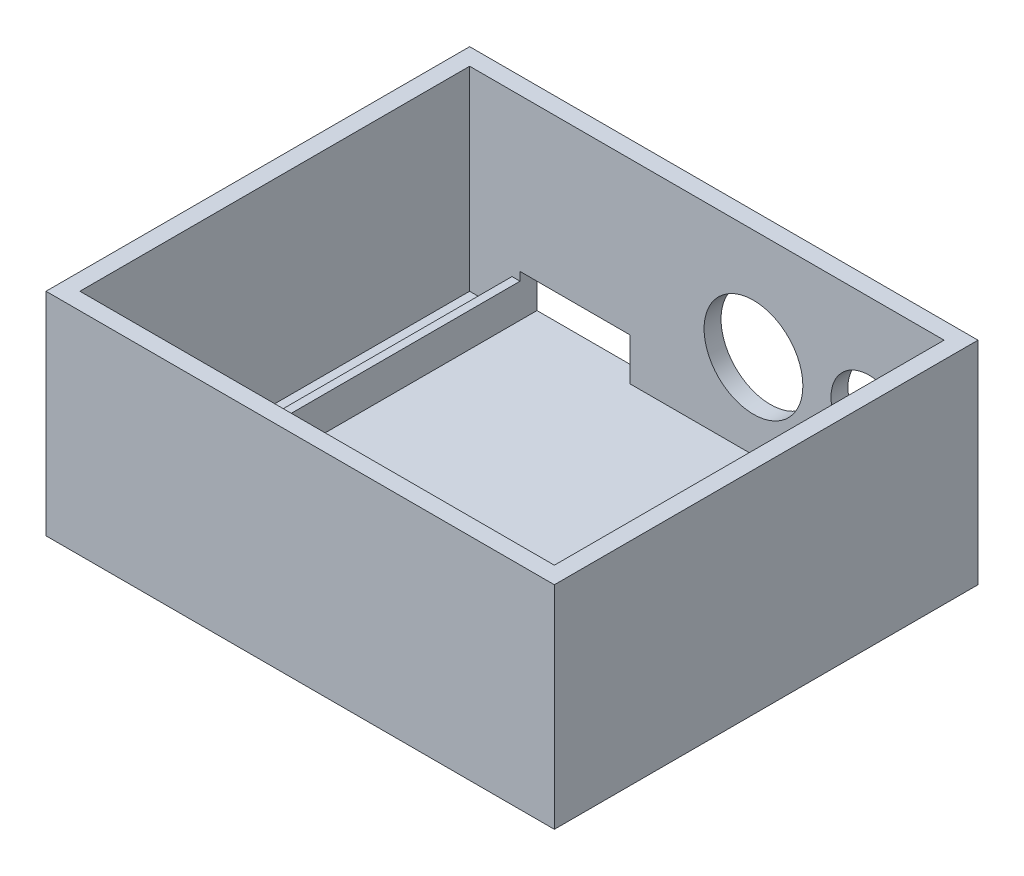
ISO-10303-21;
HEADER;
FILE_DESCRIPTION(('STEP AP214'),'2;1');
FILE_NAME('part.step','',(''),(''),'','','');
FILE_SCHEMA(('AUTOMOTIVE_DESIGN { 1 0 10303 214 1 1 1 1 }'));
ENDSEC;
DATA;
#1=APPLICATION_CONTEXT('core data for automotive mechanical design processes');
#2=APPLICATION_PROTOCOL_DEFINITION('international standard','automotive_design',2000,#1);
#3=PRODUCT_CONTEXT('',#1,'mechanical');
#4=PRODUCT('Part','Part','',(#3));
#5=PRODUCT_RELATED_PRODUCT_CATEGORY('part','',(#4));
#6=PRODUCT_DEFINITION_FORMATION('','',#4);
#7=PRODUCT_DEFINITION_CONTEXT('part definition',#1,'design');
#8=PRODUCT_DEFINITION('design','',#6,#7);
#9=PRODUCT_DEFINITION_SHAPE('','',#8);
#10=(LENGTH_UNIT() NAMED_UNIT(*) SI_UNIT(.MILLI.,.METRE.));
#11=(NAMED_UNIT(*) PLANE_ANGLE_UNIT() SI_UNIT($,.RADIAN.));
#12=(NAMED_UNIT(*) SI_UNIT($,.STERADIAN.) SOLID_ANGLE_UNIT());
#13=UNCERTAINTY_MEASURE_WITH_UNIT(LENGTH_MEASURE(1.E-05),#10,'distance_accuracy_value','');
#14=(GEOMETRIC_REPRESENTATION_CONTEXT(3) GLOBAL_UNCERTAINTY_ASSIGNED_CONTEXT((#13)) GLOBAL_UNIT_ASSIGNED_CONTEXT((#10,
#11,#12)) REPRESENTATION_CONTEXT('',''));
#15=CARTESIAN_POINT('',(0.,0.,0.));
#16=DIRECTION('',(0.,0.,1.));
#17=DIRECTION('',(1.,0.,0.));
#18=AXIS2_PLACEMENT_3D('',#15,#16,#17);
#19=CARTESIAN_POINT('',(-66.5712229422652,4.,-56.0826927806848));
#20=DIRECTION('',(0.,0.,-1.));
#21=DIRECTION('',(-1.,0.,0.));
#22=AXIS2_PLACEMENT_3D('',#19,#20,#21);
#23=PLANE('',#22);
#24=CARTESIAN_POINT('',(0.42877705773485,24.,-56.0826927806848));
#25=DIRECTION('',(0.,0.,1.));
#26=DIRECTION('',(1.,0.,0.));
#27=AXIS2_PLACEMENT_3D('',#24,#25,#26);
#28=CIRCLE('',#27,11.6621974263481);
#29=CARTESIAN_POINT('',(12.090974484083,24.,-56.0826927806848));
#30=VERTEX_POINT('',#29);
#31=EDGE_CURVE('E336',#30,#30,#28,.T.);
#32=ORIENTED_EDGE('',*,*,#31,.F.);
#33=EDGE_LOOP('',(#32));
#34=FACE_BOUND('',#33,.T.);
#35=CARTESIAN_POINT('',(27.7287770577348,25.,-56.0826927806848));
#36=DIRECTION('',(0.,0.,-1.));
#37=DIRECTION('',(-1.,0.,0.));
#38=AXIS2_PLACEMENT_3D('',#35,#36,#37);
#39=CIRCLE('',#38,9.);
#40=CARTESIAN_POINT('',(18.7287770577348,25.,-56.0826927806848));
#41=VERTEX_POINT('',#40);
#42=EDGE_CURVE('E328',#41,#41,#39,.T.);
#43=ORIENTED_EDGE('',*,*,#42,.T.);
#44=EDGE_LOOP('',(#43));
#45=FACE_BOUND('',#44,.T.);
#46=DIRECTION('',(1.,0.,0.));
#47=VECTOR('',#46,1.);
#48=CARTESIAN_POINT('',(-66.5712229422652,12.,-56.0826927806848));
#49=LINE('',#48,#47);
#50=CARTESIAN_POINT('',(-56.5712229422651,12.,-56.0826927806848));
#51=VERTEX_POINT('',#50);
#52=CARTESIAN_POINT('',(-54.6743041305773,12.,-56.0826927806848));
#53=VERTEX_POINT('',#52);
#54=EDGE_CURVE('E226',#51,#53,#49,.T.);
#55=ORIENTED_EDGE('',*,*,#54,.T.);
#56=DIRECTION('',(0.,-1.,0.));
#57=VECTOR('',#56,1.);
#58=CARTESIAN_POINT('',(-54.6743041305773,4.,-56.0826927806848));
#59=LINE('',#58,#57);
#60=CARTESIAN_POINT('',(-54.6743041305773,14.,-56.0826927806848));
#61=VERTEX_POINT('',#60);
#62=EDGE_CURVE('E159',#61,#53,#59,.T.);
#63=ORIENTED_EDGE('',*,*,#62,.F.);
#64=DIRECTION('',(-1.,0.,0.));
#65=VECTOR('',#64,1.);
#66=CARTESIAN_POINT('',(-54.6743041305773,14.,-56.0826927806848));
#67=LINE('',#66,#65);
#68=CARTESIAN_POINT('',(-28.6743041305773,14.,-56.0826927806848));
#69=VERTEX_POINT('',#68);
#70=EDGE_CURVE('E151',#69,#61,#67,.T.);
#71=ORIENTED_EDGE('',*,*,#70,.F.);
#72=DIRECTION('',(0.,1.,0.));
#73=VECTOR('',#72,1.);
#74=CARTESIAN_POINT('',(-28.6743041305773,4.,-56.0826927806848));
#75=LINE('',#74,#73);
#76=CARTESIAN_POINT('',(-28.6743041305773,4.,-56.0826927806848));
#77=VERTEX_POINT('',#76);
#78=EDGE_CURVE('E145',#77,#69,#75,.T.);
#79=ORIENTED_EDGE('',*,*,#78,.F.);
#80=DIRECTION('',(-1.,0.,0.));
#81=VECTOR('',#80,1.);
#82=CARTESIAN_POINT('',(-66.5712229422652,4.,-56.0826927806848));
#83=LINE('',#82,#81);
#84=CARTESIAN_POINT('',(45.4287770577348,4.,-56.0826927806848));
#85=VERTEX_POINT('',#84);
#86=EDGE_CURVE('E156',#85,#77,#83,.T.);
#87=ORIENTED_EDGE('',*,*,#86,.F.);
#88=DIRECTION('',(0.,1.,0.));
#89=VECTOR('',#88,1.);
#90=CARTESIAN_POINT('',(45.4287770577348,4.,-56.0826927806848));
#91=LINE('',#90,#89);
#92=CARTESIAN_POINT('',(45.4287770577348,50.,-56.0826927806848));
#93=VERTEX_POINT('',#92);
#94=EDGE_CURVE('E191',#85,#93,#91,.T.);
#95=ORIENTED_EDGE('',*,*,#94,.T.);
#96=DIRECTION('',(-1.,0.,0.));
#97=VECTOR('',#96,1.);
#98=CARTESIAN_POINT('',(-66.5712229422652,50.,-56.0826927806848));
#99=LINE('',#98,#97);
#100=CARTESIAN_POINT('',(-66.5712229422652,50.,-56.0826927806848));
#101=VERTEX_POINT('',#100);
#102=EDGE_CURVE('E184',#93,#101,#99,.T.);
#103=ORIENTED_EDGE('',*,*,#102,.T.);
#104=DIRECTION('',(0.,1.,0.));
#105=VECTOR('',#104,1.);
#106=CARTESIAN_POINT('',(-66.5712229422652,4.,-56.0826927806848));
#107=LINE('',#106,#105);
#108=CARTESIAN_POINT('',(-66.5712229422652,4.,-56.0826927806848));
#109=VERTEX_POINT('',#108);
#110=EDGE_CURVE('E188',#109,#101,#107,.T.);
#111=ORIENTED_EDGE('',*,*,#110,.F.);
#112=CARTESIAN_POINT('',(-56.5712229422651,4.,-56.0826927806848));
#113=VERTEX_POINT('',#112);
#114=EDGE_CURVE('E167',#113,#109,#83,.T.);
#115=ORIENTED_EDGE('',*,*,#114,.F.);
#116=DIRECTION('',(0.,-1.,0.));
#117=VECTOR('',#116,1.);
#118=CARTESIAN_POINT('',(-56.5712229422651,4.,-56.0826927806848));
#119=LINE('',#118,#117);
#120=EDGE_CURVE('E178',#51,#113,#119,.T.);
#121=ORIENTED_EDGE('',*,*,#120,.F.);
#122=EDGE_LOOP('',(#55,#63,#71,#79,#87,#95,#103,#111,#115,#121));
#123=FACE_BOUND('',#122,.T.);
#124=ADVANCED_FACE('F34',(#34,#45,#123),#23,.F.);
#125=CARTESIAN_POINT('',(0.,4.,0.));
#126=DIRECTION('',(0.,1.,0.));
#127=DIRECTION('',(0.,0.,1.));
#128=AXIS2_PLACEMENT_3D('',#125,#126,#127);
#129=PLANE('',#128);
#130=ORIENTED_EDGE('',*,*,#86,.T.);
#131=DIRECTION('',(0.,0.,1.));
#132=VECTOR('',#131,1.);
#133=CARTESIAN_POINT('',(-28.6743041305773,4.,-122.082692780685));
#134=LINE('',#133,#132);
#135=CARTESIAN_POINT('',(-28.6743041305773,4.,-60.0826927806848));
#136=VERTEX_POINT('',#135);
#137=EDGE_CURVE('E50',#136,#77,#134,.T.);
#138=ORIENTED_EDGE('',*,*,#137,.F.);
#139=DIRECTION('',(1.,0.,0.));
#140=VECTOR('',#139,1.);
#141=CARTESIAN_POINT('',(-70.5712229422652,4.,-60.0826927806848));
#142=LINE('',#141,#140);
#143=CARTESIAN_POINT('',(-54.6743041305773,4.,-60.0826927806848));
#144=VERTEX_POINT('',#143);
#145=EDGE_CURVE('E228',#144,#136,#142,.T.);
#146=ORIENTED_EDGE('',*,*,#145,.F.);
#147=DIRECTION('',(0.,0.,1.));
#148=VECTOR('',#147,1.);
#149=CARTESIAN_POINT('',(-54.6743041305773,4.,-56.0826927806848));
#150=LINE('',#149,#148);
#151=CARTESIAN_POINT('',(-54.6743041305773,4.,9.91730721931521));
#152=VERTEX_POINT('',#151);
#153=EDGE_CURVE('E244',#144,#152,#150,.T.);
#154=ORIENTED_EDGE('',*,*,#153,.T.);
#155=DIRECTION('',(1.,0.,0.));
#156=VECTOR('',#155,1.);
#157=CARTESIAN_POINT('',(-56.5712229422652,4.,9.91730721931521));
#158=LINE('',#157,#156);
#159=CARTESIAN_POINT('',(-56.5712229422652,4.,9.91730721931521));
#160=VERTEX_POINT('',#159);
#161=EDGE_CURVE('E247',#160,#152,#158,.T.);
#162=ORIENTED_EDGE('',*,*,#161,.F.);
#163=DIRECTION('',(0.,0.,-1.));
#164=VECTOR('',#163,1.);
#165=CARTESIAN_POINT('',(-56.5712229422652,4.,0.));
#166=LINE('',#165,#164);
#167=EDGE_CURVE('E223',#160,#113,#166,.T.);
#168=ORIENTED_EDGE('',*,*,#167,.T.);
#169=ORIENTED_EDGE('',*,*,#114,.T.);
#170=DIRECTION('',(0.,0.,1.));
#171=VECTOR('',#170,1.);
#172=CARTESIAN_POINT('',(-66.5712229422652,4.,-56.0826927806848));
#173=LINE('',#172,#171);
#174=CARTESIAN_POINT('',(-66.5712229422651,4.,35.9173072193152));
#175=VERTEX_POINT('',#174);
#176=EDGE_CURVE('E187',#109,#175,#173,.T.);
#177=ORIENTED_EDGE('',*,*,#176,.T.);
#178=DIRECTION('',(1.,0.,0.));
#179=VECTOR('',#178,1.);
#180=CARTESIAN_POINT('',(-66.5712229422651,4.,35.9173072193152));
#181=LINE('',#180,#179);
#182=CARTESIAN_POINT('',(45.4287770577348,4.,35.9173072193152));
#183=VERTEX_POINT('',#182);
#184=EDGE_CURVE('E261',#175,#183,#181,.T.);
#185=ORIENTED_EDGE('',*,*,#184,.T.);
#186=DIRECTION('',(0.,0.,-1.));
#187=VECTOR('',#186,1.);
#188=CARTESIAN_POINT('',(45.4287770577348,4.,-56.0826927806848));
#189=LINE('',#188,#187);
#190=EDGE_CURVE('E165',#183,#85,#189,.T.);
#191=ORIENTED_EDGE('',*,*,#190,.T.);
#192=EDGE_LOOP('',(#130,#138,#146,#154,#162,#168,#169,#177,#185,#191));
#193=FACE_BOUND('',#192,.T.);
#194=ADVANCED_FACE('F162',(#193),#129,.T.);
#195=CARTESIAN_POINT('',(-70.5712229422652,50.,39.9173072193152));
#196=DIRECTION('',(1.,0.,0.));
#197=DIRECTION('',(0.,0.,-1.));
#198=AXIS2_PLACEMENT_3D('',#195,#196,#197);
#199=PLANE('',#198);
#200=DIRECTION('',(0.,0.,1.));
#201=VECTOR('',#200,1.);
#202=CARTESIAN_POINT('',(-70.5712229422652,0.,39.9173072193152));
#203=LINE('',#202,#201);
#204=CARTESIAN_POINT('',(-70.5712229422652,0.,-60.0826927806848));
#205=VERTEX_POINT('',#204);
#206=CARTESIAN_POINT('',(-70.5712229422652,0.,39.9173072193152));
#207=VERTEX_POINT('',#206);
#208=EDGE_CURVE('E190',#205,#207,#203,.T.);
#209=ORIENTED_EDGE('',*,*,#208,.T.);
#210=DIRECTION('',(0.,-1.,0.));
#211=VECTOR('',#210,1.);
#212=CARTESIAN_POINT('',(-70.5712229422652,50.,39.9173072193152));
#213=LINE('',#212,#211);
#214=CARTESIAN_POINT('',(-70.5712229422652,50.,39.9173072193152));
#215=VERTEX_POINT('',#214);
#216=EDGE_CURVE('E220',#215,#207,#213,.T.);
#217=ORIENTED_EDGE('',*,*,#216,.F.);
#218=DIRECTION('',(0.,0.,1.));
#219=VECTOR('',#218,1.);
#220=CARTESIAN_POINT('',(-70.5712229422652,50.,39.9173072193152));
#221=LINE('',#220,#219);
#222=CARTESIAN_POINT('',(-70.5712229422652,50.,-60.0826927806848));
#223=VERTEX_POINT('',#222);
#224=EDGE_CURVE('E194',#223,#215,#221,.T.);
#225=ORIENTED_EDGE('',*,*,#224,.F.);
#226=DIRECTION('',(0.,-1.,0.));
#227=VECTOR('',#226,1.);
#228=CARTESIAN_POINT('',(-70.5712229422652,50.,-60.0826927806848));
#229=LINE('',#228,#227);
#230=EDGE_CURVE('E204',#223,#205,#229,.T.);
#231=ORIENTED_EDGE('',*,*,#230,.T.);
#232=EDGE_LOOP('',(#209,#217,#225,#231));
#233=FACE_BOUND('',#232,.T.);
#234=ADVANCED_FACE('F36',(#233),#199,.F.);
#235=CARTESIAN_POINT('',(-70.5712229422652,50.,39.9173072193152));
#236=DIRECTION('',(0.,0.,-1.));
#237=DIRECTION('',(-1.,0.,0.));
#238=AXIS2_PLACEMENT_3D('',#235,#236,#237);
#239=PLANE('',#238);
#240=DIRECTION('',(1.,0.,0.));
#241=VECTOR('',#240,1.);
#242=CARTESIAN_POINT('',(-70.5712229422652,0.,39.9173072193152));
#243=LINE('',#242,#241);
#244=CARTESIAN_POINT('',(49.4287770577348,0.,39.9173072193152));
#245=VERTEX_POINT('',#244);
#246=EDGE_CURVE('E207',#207,#245,#243,.T.);
#247=ORIENTED_EDGE('',*,*,#246,.T.);
#248=DIRECTION('',(0.,-1.,0.));
#249=VECTOR('',#248,1.);
#250=CARTESIAN_POINT('',(49.4287770577348,50.,39.9173072193152));
#251=LINE('',#250,#249);
#252=CARTESIAN_POINT('',(49.4287770577348,50.,39.9173072193152));
#253=VERTEX_POINT('',#252);
#254=EDGE_CURVE('E217',#253,#245,#251,.T.);
#255=ORIENTED_EDGE('',*,*,#254,.F.);
#256=DIRECTION('',(1.,0.,0.));
#257=VECTOR('',#256,1.);
#258=CARTESIAN_POINT('',(-70.5712229422652,50.,39.9173072193152));
#259=LINE('',#258,#257);
#260=EDGE_CURVE('E197',#215,#253,#259,.T.);
#261=ORIENTED_EDGE('',*,*,#260,.F.);
#262=ORIENTED_EDGE('',*,*,#216,.T.);
#263=EDGE_LOOP('',(#247,#255,#261,#262));
#264=FACE_BOUND('',#263,.T.);
#265=ADVANCED_FACE('F478',(#264),#239,.F.);
#266=CARTESIAN_POINT('',(49.4287770577348,50.,39.9173072193152));
#267=DIRECTION('',(-1.,0.,0.));
#268=DIRECTION('',(0.,0.,1.));
#269=AXIS2_PLACEMENT_3D('',#266,#267,#268);
#270=PLANE('',#269);
#271=DIRECTION('',(0.,0.,-1.));
#272=VECTOR('',#271,1.);
#273=CARTESIAN_POINT('',(49.4287770577348,0.,39.9173072193152));
#274=LINE('',#273,#272);
#275=CARTESIAN_POINT('',(49.4287770577348,0.,-60.0826927806848));
#276=VERTEX_POINT('',#275);
#277=EDGE_CURVE('E209',#245,#276,#274,.T.);
#278=ORIENTED_EDGE('',*,*,#277,.T.);
#279=DIRECTION('',(0.,-1.,0.));
#280=VECTOR('',#279,1.);
#281=CARTESIAN_POINT('',(49.4287770577348,50.,-60.0826927806848));
#282=LINE('',#281,#280);
#283=CARTESIAN_POINT('',(49.4287770577348,50.,-60.0826927806848));
#284=VERTEX_POINT('',#283);
#285=EDGE_CURVE('E214',#284,#276,#282,.T.);
#286=ORIENTED_EDGE('',*,*,#285,.F.);
#287=DIRECTION('',(0.,0.,-1.));
#288=VECTOR('',#287,1.);
#289=CARTESIAN_POINT('',(49.4287770577348,50.,39.9173072193152));
#290=LINE('',#289,#288);
#291=EDGE_CURVE('E200',#253,#284,#290,.T.);
#292=ORIENTED_EDGE('',*,*,#291,.F.);
#293=ORIENTED_EDGE('',*,*,#254,.T.);
#294=EDGE_LOOP('',(#278,#286,#292,#293));
#295=FACE_BOUND('',#294,.T.);
#296=ADVANCED_FACE('F384',(#295),#270,.F.);
#297=CARTESIAN_POINT('',(-70.5712229422652,50.,-60.0826927806848));
#298=DIRECTION('',(0.,0.,1.));
#299=DIRECTION('',(1.,0.,0.));
#300=AXIS2_PLACEMENT_3D('',#297,#298,#299);
#301=PLANE('',#300);
#302=CARTESIAN_POINT('',(0.42877705773485,24.,-60.0826927806848));
#303=DIRECTION('',(0.,0.,1.));
#304=DIRECTION('',(1.,0.,0.));
#305=AXIS2_PLACEMENT_3D('',#302,#303,#304);
#306=CIRCLE('',#305,11.6621974263481);
#307=CARTESIAN_POINT('',(12.090974484083,24.,-60.0826927806848));
#308=VERTEX_POINT('',#307);
#309=EDGE_CURVE('E38',#308,#308,#306,.T.);
#310=ORIENTED_EDGE('',*,*,#309,.T.);
#311=EDGE_LOOP('',(#310));
#312=FACE_BOUND('',#311,.T.);
#313=CARTESIAN_POINT('',(27.7287770577348,25.,-60.0826927806848));
#314=DIRECTION('',(0.,0.,-1.));
#315=DIRECTION('',(-1.,0.,0.));
#316=AXIS2_PLACEMENT_3D('',#313,#314,#315);
#317=CIRCLE('',#316,9.);
#318=CARTESIAN_POINT('',(18.7287770577348,25.,-60.0826927806848));
#319=VERTEX_POINT('',#318);
#320=EDGE_CURVE('E331',#319,#319,#317,.T.);
#321=ORIENTED_EDGE('',*,*,#320,.F.);
#322=EDGE_LOOP('',(#321));
#323=FACE_BOUND('',#322,.T.);
#324=DIRECTION('',(-1.,0.,0.));
#325=VECTOR('',#324,1.);
#326=CARTESIAN_POINT('',(-70.5712229422652,14.,-60.0826927806848));
#327=LINE('',#326,#325);
#328=CARTESIAN_POINT('',(-28.6743041305773,14.,-60.0826927806848));
#329=VERTEX_POINT('',#328);
#330=CARTESIAN_POINT('',(-54.6743041305773,14.,-60.0826927806848));
#331=VERTEX_POINT('',#330);
#332=EDGE_CURVE('E43',#329,#331,#327,.T.);
#333=ORIENTED_EDGE('',*,*,#332,.T.);
#334=DIRECTION('',(0.,-1.,0.));
#335=VECTOR('',#334,1.);
#336=CARTESIAN_POINT('',(-54.6743041305773,50.,-60.0826927806848));
#337=LINE('',#336,#335);
#338=EDGE_CURVE('E11',#331,#144,#337,.T.);
#339=ORIENTED_EDGE('',*,*,#338,.T.);
#340=ORIENTED_EDGE('',*,*,#145,.T.);
#341=DIRECTION('',(0.,1.,0.));
#342=VECTOR('',#341,1.);
#343=CARTESIAN_POINT('',(-28.6743041305773,50.,-60.0826927806848));
#344=LINE('',#343,#342);
#345=EDGE_CURVE('E148',#136,#329,#344,.T.);
#346=ORIENTED_EDGE('',*,*,#345,.T.);
#347=EDGE_LOOP('',(#333,#339,#340,#346));
#348=FACE_BOUND('',#347,.T.);
#349=DIRECTION('',(-1.,0.,0.));
#350=VECTOR('',#349,1.);
#351=CARTESIAN_POINT('',(-70.5712229422652,0.,-60.0826927806848));
#352=LINE('',#351,#350);
#353=EDGE_CURVE('E198',#276,#205,#352,.T.);
#354=ORIENTED_EDGE('',*,*,#353,.T.);
#355=ORIENTED_EDGE('',*,*,#230,.F.);
#356=DIRECTION('',(-1.,0.,0.));
#357=VECTOR('',#356,1.);
#358=CARTESIAN_POINT('',(-70.5712229422652,50.,-60.0826927806848));
#359=LINE('',#358,#357);
#360=EDGE_CURVE('E202',#284,#223,#359,.T.);
#361=ORIENTED_EDGE('',*,*,#360,.F.);
#362=ORIENTED_EDGE('',*,*,#285,.T.);
#363=EDGE_LOOP('',(#354,#355,#361,#362));
#364=FACE_BOUND('',#363,.T.);
#365=ADVANCED_FACE('F233',(#312,#323,#348,#364),#301,.F.);
#366=CARTESIAN_POINT('',(0.,50.,0.));
#367=DIRECTION('',(0.,-1.,0.));
#368=DIRECTION('',(0.,0.,-1.));
#369=AXIS2_PLACEMENT_3D('',#366,#367,#368);
#370=PLANE('',#369);
#371=DIRECTION('',(1.,0.,0.));
#372=VECTOR('',#371,1.);
#373=CARTESIAN_POINT('',(-66.5712229422651,50.,35.9173072193152));
#374=LINE('',#373,#372);
#375=CARTESIAN_POINT('',(-66.5712229422651,50.,35.9173072193152));
#376=VERTEX_POINT('',#375);
#377=CARTESIAN_POINT('',(45.4287770577348,50.,35.9173072193152));
#378=VERTEX_POINT('',#377);
#379=EDGE_CURVE('E177',#376,#378,#374,.T.);
#380=ORIENTED_EDGE('',*,*,#379,.F.);
#381=DIRECTION('',(0.,0.,1.));
#382=VECTOR('',#381,1.);
#383=CARTESIAN_POINT('',(-66.5712229422652,50.,-56.0826927806848));
#384=LINE('',#383,#382);
#385=EDGE_CURVE('E175',#101,#376,#384,.T.);
#386=ORIENTED_EDGE('',*,*,#385,.F.);
#387=ORIENTED_EDGE('',*,*,#102,.F.);
#388=DIRECTION('',(0.,0.,-1.));
#389=VECTOR('',#388,1.);
#390=CARTESIAN_POINT('',(45.4287770577348,50.,-56.0826927806848));
#391=LINE('',#390,#389);
#392=EDGE_CURVE('E181',#378,#93,#391,.T.);
#393=ORIENTED_EDGE('',*,*,#392,.F.);
#394=EDGE_LOOP('',(#380,#386,#387,#393));
#395=FACE_BOUND('',#394,.T.);
#396=ORIENTED_EDGE('',*,*,#224,.T.);
#397=ORIENTED_EDGE('',*,*,#260,.T.);
#398=ORIENTED_EDGE('',*,*,#291,.T.);
#399=ORIENTED_EDGE('',*,*,#360,.T.);
#400=EDGE_LOOP('',(#396,#397,#398,#399));
#401=FACE_BOUND('',#400,.T.);
#402=ADVANCED_FACE('F275',(#395,#401),#370,.F.);
#403=CARTESIAN_POINT('',(0.,0.,0.));
#404=DIRECTION('',(0.,-1.,0.));
#405=DIRECTION('',(0.,0.,-1.));
#406=AXIS2_PLACEMENT_3D('',#403,#404,#405);
#407=PLANE('',#406);
#408=ORIENTED_EDGE('',*,*,#208,.F.);
#409=ORIENTED_EDGE('',*,*,#353,.F.);
#410=ORIENTED_EDGE('',*,*,#277,.F.);
#411=ORIENTED_EDGE('',*,*,#246,.F.);
#412=EDGE_LOOP('',(#408,#409,#410,#411));
#413=FACE_BOUND('',#412,.T.);
#414=ADVANCED_FACE('F280',(#413),#407,.T.);
#415=CARTESIAN_POINT('',(-66.5712229422652,4.,-56.0826927806848));
#416=DIRECTION('',(-1.,0.,0.));
#417=DIRECTION('',(0.,0.,1.));
#418=AXIS2_PLACEMENT_3D('',#415,#416,#417);
#419=PLANE('',#418);
#420=ORIENTED_EDGE('',*,*,#385,.T.);
#421=DIRECTION('',(0.,1.,0.));
#422=VECTOR('',#421,1.);
#423=CARTESIAN_POINT('',(-66.5712229422651,4.,35.9173072193152));
#424=LINE('',#423,#422);
#425=EDGE_CURVE('E166',#175,#376,#424,.T.);
#426=ORIENTED_EDGE('',*,*,#425,.F.);
#427=ORIENTED_EDGE('',*,*,#176,.F.);
#428=ORIENTED_EDGE('',*,*,#110,.T.);
#429=EDGE_LOOP('',(#420,#426,#427,#428));
#430=FACE_BOUND('',#429,.T.);
#431=ADVANCED_FACE('F278',(#430),#419,.F.);
#432=CARTESIAN_POINT('',(45.4287770577348,4.,-56.0826927806848));
#433=DIRECTION('',(1.,0.,0.));
#434=DIRECTION('',(0.,0.,-1.));
#435=AXIS2_PLACEMENT_3D('',#432,#433,#434);
#436=PLANE('',#435);
#437=ORIENTED_EDGE('',*,*,#392,.T.);
#438=ORIENTED_EDGE('',*,*,#94,.F.);
#439=ORIENTED_EDGE('',*,*,#190,.F.);
#440=DIRECTION('',(0.,1.,0.));
#441=VECTOR('',#440,1.);
#442=CARTESIAN_POINT('',(45.4287770577348,4.,35.9173072193152));
#443=LINE('',#442,#441);
#444=EDGE_CURVE('E170',#183,#378,#443,.T.);
#445=ORIENTED_EDGE('',*,*,#444,.T.);
#446=EDGE_LOOP('',(#437,#438,#439,#445));
#447=FACE_BOUND('',#446,.T.);
#448=ADVANCED_FACE('F269',(#447),#436,.F.);
#449=CARTESIAN_POINT('',(-66.5712229422651,4.,35.9173072193152));
#450=DIRECTION('',(0.,0.,1.));
#451=DIRECTION('',(1.,0.,0.));
#452=AXIS2_PLACEMENT_3D('',#449,#450,#451);
#453=PLANE('',#452);
#454=ORIENTED_EDGE('',*,*,#379,.T.);
#455=ORIENTED_EDGE('',*,*,#444,.F.);
#456=ORIENTED_EDGE('',*,*,#184,.F.);
#457=ORIENTED_EDGE('',*,*,#425,.T.);
#458=EDGE_LOOP('',(#454,#455,#456,#457));
#459=FACE_BOUND('',#458,.T.);
#460=ADVANCED_FACE('F265',(#459),#453,.F.);
#461=CARTESIAN_POINT('',(0.,12.,0.));
#462=DIRECTION('',(0.,1.,0.));
#463=DIRECTION('',(0.,0.,1.));
#464=AXIS2_PLACEMENT_3D('',#461,#462,#463);
#465=PLANE('',#464);
#466=DIRECTION('',(0.,0.,1.));
#467=VECTOR('',#466,1.);
#468=CARTESIAN_POINT('',(-54.6743041305773,12.,-56.0826927806848));
#469=LINE('',#468,#467);
#470=CARTESIAN_POINT('',(-54.6743041305773,12.,9.91730721931521));
#471=VERTEX_POINT('',#470);
#472=EDGE_CURVE('E245',#53,#471,#469,.T.);
#473=ORIENTED_EDGE('',*,*,#472,.F.);
#474=ORIENTED_EDGE('',*,*,#54,.F.);
#475=DIRECTION('',(0.,0.,1.));
#476=VECTOR('',#475,1.);
#477=CARTESIAN_POINT('',(-56.5712229422651,12.,-60.0826927806848));
#478=LINE('',#477,#476);
#479=CARTESIAN_POINT('',(-56.5712229422652,12.,9.91730721931521));
#480=VERTEX_POINT('',#479);
#481=EDGE_CURVE('E249',#51,#480,#478,.T.);
#482=ORIENTED_EDGE('',*,*,#481,.T.);
#483=DIRECTION('',(1.,0.,0.));
#484=VECTOR('',#483,1.);
#485=CARTESIAN_POINT('',(-56.5712229422652,12.,9.91730721931521));
#486=LINE('',#485,#484);
#487=EDGE_CURVE('E251',#480,#471,#486,.T.);
#488=ORIENTED_EDGE('',*,*,#487,.T.);
#489=EDGE_LOOP('',(#473,#474,#482,#488));
#490=FACE_BOUND('',#489,.T.);
#491=ADVANCED_FACE('F302',(#490),#465,.T.);
#492=CARTESIAN_POINT('',(-56.5712229422651,12.,-60.0826927806848));
#493=DIRECTION('',(1.,0.,0.));
#494=DIRECTION('',(0.,0.,-1.));
#495=AXIS2_PLACEMENT_3D('',#492,#493,#494);
#496=PLANE('',#495);
#497=ORIENTED_EDGE('',*,*,#481,.F.);
#498=ORIENTED_EDGE('',*,*,#120,.T.);
#499=ORIENTED_EDGE('',*,*,#167,.F.);
#500=DIRECTION('',(0.,-1.,0.));
#501=VECTOR('',#500,1.);
#502=CARTESIAN_POINT('',(-56.5712229422652,12.,9.91730721931521));
#503=LINE('',#502,#501);
#504=EDGE_CURVE('E254',#480,#160,#503,.T.);
#505=ORIENTED_EDGE('',*,*,#504,.F.);
#506=EDGE_LOOP('',(#497,#498,#499,#505));
#507=FACE_BOUND('',#506,.T.);
#508=ADVANCED_FACE('F306',(#507),#496,.F.);
#509=CARTESIAN_POINT('',(-56.5712229422652,12.,9.91730721931521));
#510=DIRECTION('',(0.,0.,-1.));
#511=DIRECTION('',(-1.,0.,0.));
#512=AXIS2_PLACEMENT_3D('',#509,#510,#511);
#513=PLANE('',#512);
#514=ORIENTED_EDGE('',*,*,#161,.T.);
#515=DIRECTION('',(0.,-1.,0.));
#516=VECTOR('',#515,1.);
#517=CARTESIAN_POINT('',(-54.6743041305773,12.,9.91730721931521));
#518=LINE('',#517,#516);
#519=EDGE_CURVE('E58',#471,#152,#518,.T.);
#520=ORIENTED_EDGE('',*,*,#519,.F.);
#521=ORIENTED_EDGE('',*,*,#487,.F.);
#522=ORIENTED_EDGE('',*,*,#504,.T.);
#523=EDGE_LOOP('',(#514,#520,#521,#522));
#524=FACE_BOUND('',#523,.T.);
#525=ADVANCED_FACE('F312',(#524),#513,.F.);
#526=CARTESIAN_POINT('',(-54.6743041305773,12.,-56.0826927806848));
#527=DIRECTION('',(-1.,0.,0.));
#528=DIRECTION('',(0.,0.,1.));
#529=AXIS2_PLACEMENT_3D('',#526,#527,#528);
#530=PLANE('',#529);
#531=ORIENTED_EDGE('',*,*,#519,.T.);
#532=ORIENTED_EDGE('',*,*,#153,.F.);
#533=ORIENTED_EDGE('',*,*,#338,.F.);
#534=DIRECTION('',(0.,0.,1.));
#535=VECTOR('',#534,1.);
#536=CARTESIAN_POINT('',(-54.6743041305773,14.,-122.082692780685));
#537=LINE('',#536,#535);
#538=EDGE_CURVE('E238',#331,#61,#537,.T.);
#539=ORIENTED_EDGE('',*,*,#538,.T.);
#540=ORIENTED_EDGE('',*,*,#62,.T.);
#541=ORIENTED_EDGE('',*,*,#472,.T.);
#542=EDGE_LOOP('',(#531,#532,#533,#539,#540,#541));
#543=FACE_BOUND('',#542,.T.);
#544=ADVANCED_FACE('F317',(#543),#530,.F.);
#545=CARTESIAN_POINT('',(-54.6743041305773,14.,-122.082692780685));
#546=DIRECTION('',(0.,1.,0.));
#547=DIRECTION('',(0.,0.,1.));
#548=AXIS2_PLACEMENT_3D('',#545,#546,#547);
#549=PLANE('',#548);
#550=DIRECTION('',(0.,0.,1.));
#551=VECTOR('',#550,1.);
#552=CARTESIAN_POINT('',(-28.6743041305773,14.,-122.082692780685));
#553=LINE('',#552,#551);
#554=EDGE_CURVE('E150',#329,#69,#553,.T.);
#555=ORIENTED_EDGE('',*,*,#554,.T.);
#556=ORIENTED_EDGE('',*,*,#70,.T.);
#557=ORIENTED_EDGE('',*,*,#538,.F.);
#558=ORIENTED_EDGE('',*,*,#332,.F.);
#559=EDGE_LOOP('',(#555,#556,#557,#558));
#560=FACE_BOUND('',#559,.T.);
#561=ADVANCED_FACE('F237',(#560),#549,.F.);
#562=CARTESIAN_POINT('',(-28.6743041305773,4.,-122.082692780685));
#563=DIRECTION('',(1.,0.,0.));
#564=DIRECTION('',(0.,0.,-1.));
#565=AXIS2_PLACEMENT_3D('',#562,#563,#564);
#566=PLANE('',#565);
#567=ORIENTED_EDGE('',*,*,#137,.T.);
#568=ORIENTED_EDGE('',*,*,#78,.T.);
#569=ORIENTED_EDGE('',*,*,#554,.F.);
#570=ORIENTED_EDGE('',*,*,#345,.F.);
#571=EDGE_LOOP('',(#567,#568,#569,#570));
#572=FACE_BOUND('',#571,.T.);
#573=ADVANCED_FACE('F143',(#572),#566,.F.);
#574=CARTESIAN_POINT('',(27.7287770577348,25.,-47.5826927806848));
#575=DIRECTION('',(0.,0.,-1.));
#576=DIRECTION('',(-1.,0.,0.));
#577=AXIS2_PLACEMENT_3D('',#574,#575,#576);
#578=CYLINDRICAL_SURFACE('',#577,9.);
#579=ORIENTED_EDGE('',*,*,#320,.T.);
#580=EDGE_LOOP('',(#579));
#581=FACE_BOUND('',#580,.T.);
#582=ORIENTED_EDGE('',*,*,#42,.F.);
#583=EDGE_LOOP('',(#582));
#584=FACE_BOUND('',#583,.T.);
#585=ADVANCED_FACE('F346',(#581,#584),#578,.F.);
#586=CARTESIAN_POINT('',(0.42877705773485,24.,-66.0826927806848));
#587=DIRECTION('',(0.,0.,1.));
#588=DIRECTION('',(1.,0.,0.));
#589=AXIS2_PLACEMENT_3D('',#586,#587,#588);
#590=CYLINDRICAL_SURFACE('',#589,11.6621974263481);
#591=ORIENTED_EDGE('',*,*,#31,.T.);
#592=EDGE_LOOP('',(#591));
#593=FACE_BOUND('',#592,.T.);
#594=ORIENTED_EDGE('',*,*,#309,.F.);
#595=EDGE_LOOP('',(#594));
#596=FACE_BOUND('',#595,.T.);
#597=ADVANCED_FACE('F344',(#593,#596),#590,.F.);
#598=CLOSED_SHELL('',(#124,#194,#234,#265,#296,#365,#402,#414,#431,#448,#460,#491,#508,#525,
#544,#561,#573,#585,#597));
#599=MANIFOLD_SOLID_BREP('B2',#598);
#600=ADVANCED_BREP_SHAPE_REPRESENTATION('',(#18,#599),#14);
#601=SHAPE_DEFINITION_REPRESENTATION(#9,#600);
ENDSEC;
END-ISO-10303-21;
